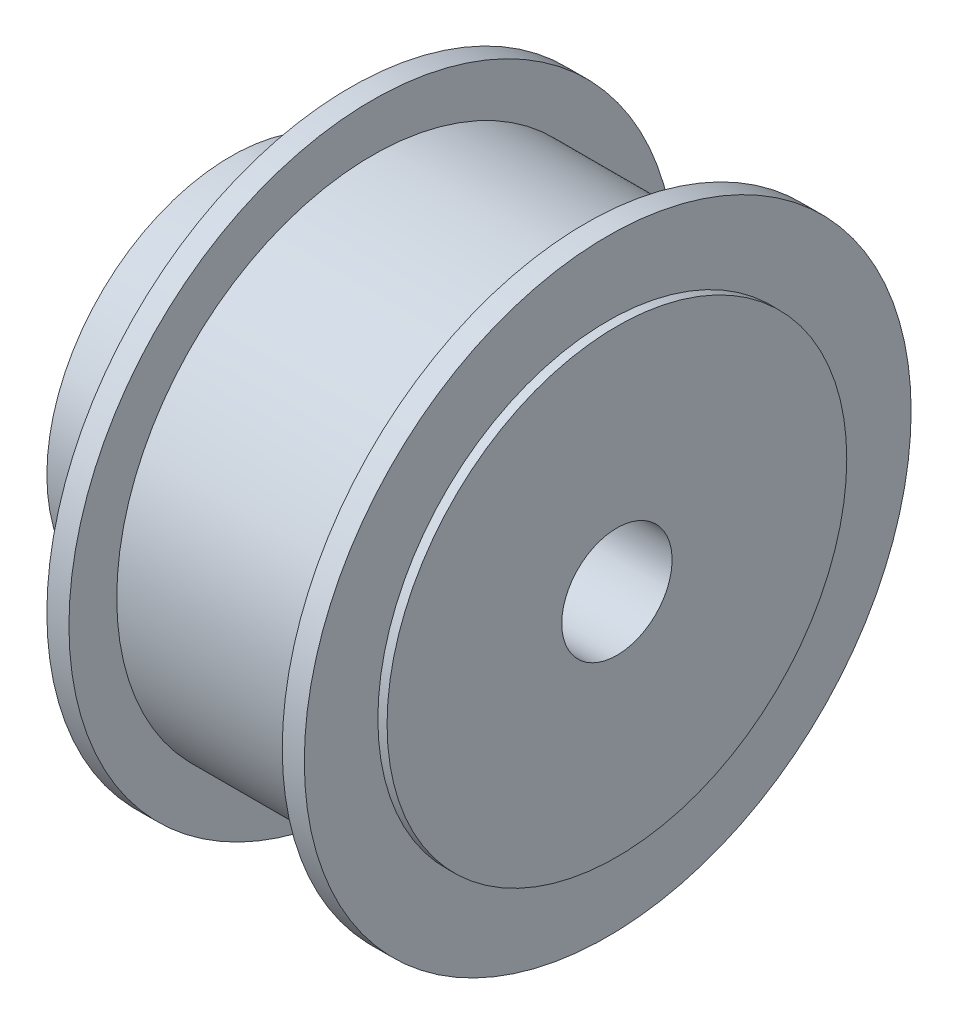
ISO-10303-21;
HEADER;
FILE_DESCRIPTION(('STEP AP214'),'2;1');
FILE_NAME('part.step','',(''),(''),'','','');
FILE_SCHEMA(('AUTOMOTIVE_DESIGN { 1 0 10303 214 1 1 1 1 }'));
ENDSEC;
DATA;
#1=APPLICATION_CONTEXT('core data for automotive mechanical design processes');
#2=APPLICATION_PROTOCOL_DEFINITION('international standard','automotive_design',2000,#1);
#3=PRODUCT_CONTEXT('',#1,'mechanical');
#4=PRODUCT('Part','Part','',(#3));
#5=PRODUCT_RELATED_PRODUCT_CATEGORY('part','',(#4));
#6=PRODUCT_DEFINITION_FORMATION('','',#4);
#7=PRODUCT_DEFINITION_CONTEXT('part definition',#1,'design');
#8=PRODUCT_DEFINITION('design','',#6,#7);
#9=PRODUCT_DEFINITION_SHAPE('','',#8);
#10=(LENGTH_UNIT() NAMED_UNIT(*) SI_UNIT(.MILLI.,.METRE.));
#11=(NAMED_UNIT(*) PLANE_ANGLE_UNIT() SI_UNIT($,.RADIAN.));
#12=(NAMED_UNIT(*) SI_UNIT($,.STERADIAN.) SOLID_ANGLE_UNIT());
#13=UNCERTAINTY_MEASURE_WITH_UNIT(LENGTH_MEASURE(1.E-05),#10,'distance_accuracy_value','');
#14=(GEOMETRIC_REPRESENTATION_CONTEXT(3) GLOBAL_UNCERTAINTY_ASSIGNED_CONTEXT((#13)) GLOBAL_UNIT_ASSIGNED_CONTEXT((#10,
#11,#12)) REPRESENTATION_CONTEXT('',''));
#15=CARTESIAN_POINT('',(0.,0.,0.));
#16=DIRECTION('',(0.,0.,1.));
#17=DIRECTION('',(1.,0.,0.));
#18=AXIS2_PLACEMENT_3D('',#15,#16,#17);
#19=CARTESIAN_POINT('',(6.,0.,0.));
#20=DIRECTION('',(-1.,0.,0.));
#21=DIRECTION('',(0.,0.,1.));
#22=AXIS2_PLACEMENT_3D('',#19,#20,#21);
#23=CYLINDRICAL_SURFACE('',#22,10.);
#24=CARTESIAN_POINT('',(1.35,0.,-10.));
#25=CARTESIAN_POINT('',(1.35000370098531,-0.0920114531057514,-9.99999843258099));
#26=CARTESIAN_POINT('',(1.35772245868542,-0.184073454347173,-9.99871684765511));
#27=CARTESIAN_POINT('',(1.38838123513793,-0.36561632253533,-9.99372775496381));
#28=CARTESIAN_POINT('',(1.4113353369588,-0.455094721351769,-9.99001800272159));
#29=CARTESIAN_POINT('',(1.47175363893592,-0.628817487751615,-9.98058875631552));
#30=CARTESIAN_POINT('',(1.5092060635603,-0.713066038744485,-9.974870893487));
#31=CARTESIAN_POINT('',(1.59752725414862,-0.874072236504042,-9.96205444853338));
#32=CARTESIAN_POINT('',(1.64839445150501,-0.950830757653329,-9.95495602786423));
#33=CARTESIAN_POINT('',(1.76260877713292,-1.09540879372213,-9.9400912001718));
#34=CARTESIAN_POINT('',(1.82605706361825,-1.16314787882339,-9.93231968689365));
#35=CARTESIAN_POINT('',(1.96341477359323,-1.28706950777735,-9.9170237472334));
#36=CARTESIAN_POINT('',(2.03732485064318,-1.34325132909589,-9.90949933632427));
#37=CARTESIAN_POINT('',(2.19405934367668,-1.44278500045253,-9.89550007731641));
#38=CARTESIAN_POINT('',(2.27693479434388,-1.48605749570899,-9.88903182722124));
#39=CARTESIAN_POINT('',(2.44890262523649,-1.55803674048924,-9.87794796970923));
#40=CARTESIAN_POINT('',(2.53799459364928,-1.58674445381556,-9.87333223970889));
#41=CARTESIAN_POINT('',(2.71901458200099,-1.6285261950301,-9.86652679242373));
#42=CARTESIAN_POINT('',(2.81090975567876,-1.64173895927951,-9.86431555933323));
#43=CARTESIAN_POINT('',(2.99563736592343,-1.65258585530687,-9.86250435770823));
#44=CARTESIAN_POINT('',(3.08846973703063,-1.65022106770359,-9.86290420804218));
#45=CARTESIAN_POINT('',(3.27144727705671,-1.63009303176278,-9.86625034802632));
#46=CARTESIAN_POINT('',(3.36161011402737,-1.61248549472488,-9.86917088684506));
#47=CARTESIAN_POINT('',(3.5376840705334,-1.5626160736781,-9.87718903199043));
#48=CARTESIAN_POINT('',(3.62359504678828,-1.53035369619838,-9.88228671162733));
#49=CARTESIAN_POINT('',(3.78919352992442,-1.45193210975571,-9.89411264039674));
#50=CARTESIAN_POINT('',(3.86884978924069,-1.4057081060585,-9.90084846298694));
#51=CARTESIAN_POINT('',(4.01933432390775,-1.30072141548377,-9.9151864393107));
#52=CARTESIAN_POINT('',(4.09016189991229,-1.24195773629987,-9.92278866158316));
#53=CARTESIAN_POINT('',(4.22187997888267,-1.11271072676603,-9.93811607123993));
#54=CARTESIAN_POINT('',(4.28263939462996,-1.04209376928223,-9.94584163094155));
#55=CARTESIAN_POINT('',(4.39146602160627,-0.891597059898565,-9.96045987838133));
#56=CARTESIAN_POINT('',(4.43953315404709,-0.811717250503357,-9.9673525609492));
#57=CARTESIAN_POINT('',(4.52162215053432,-0.644840083170753,-9.97953794169528));
#58=CARTESIAN_POINT('',(4.55563258763802,-0.557837003156559,-9.98482933722619));
#59=CARTESIAN_POINT('',(4.60852191277534,-0.37924693000247,-9.99320544362233));
#60=CARTESIAN_POINT('',(4.62740204114479,-0.287660313260821,-9.99629033536768));
#61=CARTESIAN_POINT('',(4.64931746116117,-0.103632983819161,-9.99988156603306));
#62=CARTESIAN_POINT('',(4.65253273612153,-0.0112142564118357,-10.0004171933872));
#63=CARTESIAN_POINT('',(4.64350680131974,0.172841505554681,-9.99892971175882));
#64=CARTESIAN_POINT('',(4.63126617403953,0.264478569441164,-9.99690669920295));
#65=CARTESIAN_POINT('',(4.5918255972229,0.44381495554177,-9.99054737820398));
#66=CARTESIAN_POINT('',(4.56471460569165,0.531534371938302,-9.98622483070291));
#67=CARTESIAN_POINT('',(4.49639760744493,0.701182959294593,-9.97574921956607));
#68=CARTESIAN_POINT('',(4.45519082233832,0.78311181018899,-9.96959605484327));
#69=CARTESIAN_POINT('',(4.35943868050101,0.939636398877252,-9.95606928426946));
#70=CARTESIAN_POINT('',(4.3047807140829,1.01416235726447,-9.94868555427359));
#71=CARTESIAN_POINT('',(4.18383285093121,1.15304841333209,-9.93354765732487));
#72=CARTESIAN_POINT('',(4.11754212714571,1.21740778758216,-9.92579346406183));
#73=CARTESIAN_POINT('',(3.9744038936717,1.33479962911472,-9.91069407401676));
#74=CARTESIAN_POINT('',(3.89745612890119,1.38771058951943,-9.90335382329475));
#75=CARTESIAN_POINT('',(3.73565895293253,1.47985547415617,-9.89000528724129));
#76=CARTESIAN_POINT('',(3.65080978866809,1.51908982562647,-9.88399696030451));
#77=CARTESIAN_POINT('',(3.47596046759685,1.58258535747086,-9.87402953570153));
#78=CARTESIAN_POINT('',(3.38598290020333,1.60690737863649,-9.87006212213643));
#79=CARTESIAN_POINT('',(3.20314868821944,1.64007952798876,-9.86460473721113));
#80=CARTESIAN_POINT('',(3.11029228915184,1.64893097191818,-9.86311455516768));
#81=CARTESIAN_POINT('',(2.92554935869819,1.65087457438795,-9.86278931217107));
#82=CARTESIAN_POINT('',(2.83366483980789,1.64415796786954,-9.86392203182987));
#83=CARTESIAN_POINT('',(2.65235224813613,1.61556925478547,-9.86864441177183));
#84=CARTESIAN_POINT('',(2.5629241678464,1.59369719454886,-9.87223406454433));
#85=CARTESIAN_POINT('',(2.38913475756459,1.53549112071356,-9.88145370519205));
#86=CARTESIAN_POINT('',(2.30476789254903,1.49917324977366,-9.88708141498759));
#87=CARTESIAN_POINT('',(2.14329373313968,1.41312606218935,-9.8997453323177));
#88=CARTESIAN_POINT('',(2.06618678727227,1.36339610211421,-9.90678160742252));
#89=CARTESIAN_POINT('',(1.92045450236231,1.25125259966706,-9.92157214136343));
#90=CARTESIAN_POINT('',(1.85193824018043,1.18869826623127,-9.92933379899765));
#91=CARTESIAN_POINT('',(1.72630940012324,1.05297867490409,-9.94464125601211));
#92=CARTESIAN_POINT('',(1.66919945921976,0.979810970092671,-9.95218700513286));
#93=CARTESIAN_POINT('',(1.56765257742652,0.824354696103047,-9.96627143049842));
#94=CARTESIAN_POINT('',(1.52330385202197,0.742007852048188,-9.97280295936929));
#95=CARTESIAN_POINT('',(1.44913664719369,0.570959586923796,-9.98405342047581));
#96=CARTESIAN_POINT('',(1.41930363587476,0.482264623543764,-9.98877416450827));
#97=CARTESIAN_POINT('',(1.38152065847316,0.327682758240929,-9.99483601455804));
#98=CARTESIAN_POINT('',(1.3697192511855,0.2627330667111,-9.99676220083327));
#99=CARTESIAN_POINT('',(1.35395766106689,0.131864227625941,-9.99934474465587));
#100=CARTESIAN_POINT('',(1.34999734748421,0.065945096254669,-10.0000011233775));
#101=CARTESIAN_POINT('',(1.35,0.,-10.));
#102=B_SPLINE_CURVE_WITH_KNOTS('',3,(#24,#25,#26,#27,#28,#29,#30,#31,#32,#33,#34,#35,#36,#37,
#38,#39,#40,#41,#42,#43,#44,#45,#46,#47,#48,#49,#50,#51,#52,#53,#54,#55,#56,#57,#58,#59,#60,#61,
#62,#63,#64,#65,#66,#67,#68,#69,#70,#71,#72,#73,#74,#75,#76,#77,#78,#79,#80,#81,#82,#83,#84,#85,
#86,#87,#88,#89,#90,#91,#92,#93,#94,#95,#96,#97,#98,#99,#100,#101),.UNSPECIFIED.,.T.,.F.,(4,2,2,
2,2,2,2,2,2,2,2,2,2,2,2,2,2,2,2,2,2,2,2,2,2,2,2,2,2,2,2,2,2,2,2,2,2,2,4),(0.,0.275793319008919,
0.551841928312973,0.827666799870599,1.10345943314171,1.38156673144316,1.65969141110741,
1.93949209608634,2.21927426326045,2.49653175525207,2.7737700140227,3.04820914252877,
3.32265751287872,3.59839967320043,3.87416366201708,4.15327572401922,4.43238951858748,
4.71172976565333,4.99104711092802,5.26714751096618,5.54323750600191,5.81769359979006,
6.09216485190805,6.36901711215387,6.64588906369259,6.92556925596461,7.20524071063229,
7.48376340648035,7.76226241335698,8.03735855216247,8.31245385002404,8.58724259883661,
8.86204453269318,9.1400425875962,9.41810483731134,9.6980454687132,9.97770526783284,
10.1753710978727,10.3730336317699),.UNSPECIFIED.);
#103=CARTESIAN_POINT('',(1.35,0.,-10.));
#104=VERTEX_POINT('',#103);
#105=EDGE_CURVE('E10',#104,#104,#102,.T.);
#106=ORIENTED_EDGE('',*,*,#105,.T.);
#107=EDGE_LOOP('',(#106));
#108=FACE_BOUND('',#107,.T.);
#109=CARTESIAN_POINT('',(6.,0.,0.));
#110=DIRECTION('',(1.,0.,0.));
#111=DIRECTION('',(0.,0.,-1.));
#112=AXIS2_PLACEMENT_3D('',#109,#110,#111);
#113=CIRCLE('',#112,10.);
#114=CARTESIAN_POINT('',(6.,0.,-10.));
#115=VERTEX_POINT('',#114);
#116=EDGE_CURVE('E72',#115,#115,#113,.T.);
#117=ORIENTED_EDGE('',*,*,#116,.F.);
#118=EDGE_LOOP('',(#117));
#119=FACE_BOUND('',#118,.T.);
#120=CARTESIAN_POINT('',(0.,0.,0.));
#121=DIRECTION('',(1.,0.,0.));
#122=DIRECTION('',(0.,0.,-1.));
#123=AXIS2_PLACEMENT_3D('',#120,#121,#122);
#124=CIRCLE('',#123,10.);
#125=CARTESIAN_POINT('',(0.,0.,-10.));
#126=VERTEX_POINT('',#125);
#127=EDGE_CURVE('E101',#126,#126,#124,.T.);
#128=ORIENTED_EDGE('',*,*,#127,.T.);
#129=EDGE_LOOP('',(#128));
#130=FACE_BOUND('',#129,.T.);
#131=ADVANCED_FACE('F47',(#108,#119,#130),#23,.T.);
#132=CARTESIAN_POINT('',(0.,0.,0.));
#133=DIRECTION('',(1.,0.,0.));
#134=DIRECTION('',(0.,0.,-1.));
#135=AXIS2_PLACEMENT_3D('',#132,#133,#134);
#136=PLANE('',#135);
#137=CARTESIAN_POINT('',(0.,0.,0.));
#138=DIRECTION('',(-1.,0.,0.));
#139=DIRECTION('',(0.,0.,1.));
#140=AXIS2_PLACEMENT_3D('',#137,#138,#139);
#141=CIRCLE('',#140,3.);
#142=CARTESIAN_POINT('',(0.,0.,3.));
#143=VERTEX_POINT('',#142);
#144=EDGE_CURVE('E179',#143,#143,#141,.T.);
#145=ORIENTED_EDGE('',*,*,#144,.F.);
#146=EDGE_LOOP('',(#145));
#147=FACE_BOUND('',#146,.T.);
#148=ORIENTED_EDGE('',*,*,#127,.F.);
#149=EDGE_LOOP('',(#148));
#150=FACE_BOUND('',#149,.T.);
#151=ADVANCED_FACE('F112',(#147,#150),#136,.F.);
#152=CARTESIAN_POINT('',(6.5,0.,0.));
#153=DIRECTION('',(-1.,0.,0.));
#154=DIRECTION('',(0.,0.,1.));
#155=AXIS2_PLACEMENT_3D('',#152,#153,#154);
#156=CYLINDRICAL_SURFACE('',#155,12.5);
#157=CARTESIAN_POINT('',(6.5,0.,0.));
#158=DIRECTION('',(1.,0.,0.));
#159=DIRECTION('',(0.,0.,-1.));
#160=AXIS2_PLACEMENT_3D('',#157,#158,#159);
#161=CIRCLE('',#160,12.5);
#162=CARTESIAN_POINT('',(6.5,0.,-12.5));
#163=VERTEX_POINT('',#162);
#164=EDGE_CURVE('E100',#163,#163,#161,.T.);
#165=ORIENTED_EDGE('',*,*,#164,.F.);
#166=EDGE_LOOP('',(#165));
#167=FACE_BOUND('',#166,.T.);
#168=CARTESIAN_POINT('',(6.,0.,0.));
#169=DIRECTION('',(1.,0.,0.));
#170=DIRECTION('',(0.,0.,-1.));
#171=AXIS2_PLACEMENT_3D('',#168,#169,#170);
#172=CIRCLE('',#171,12.5);
#173=CARTESIAN_POINT('',(6.,0.,-12.5));
#174=VERTEX_POINT('',#173);
#175=EDGE_CURVE('E95',#174,#174,#172,.T.);
#176=ORIENTED_EDGE('',*,*,#175,.T.);
#177=EDGE_LOOP('',(#176));
#178=FACE_BOUND('',#177,.T.);
#179=ADVANCED_FACE('F116',(#167,#178),#156,.T.);
#180=CARTESIAN_POINT('',(6.,0.,0.));
#181=DIRECTION('',(1.,0.,0.));
#182=DIRECTION('',(0.,0.,-1.));
#183=AXIS2_PLACEMENT_3D('',#180,#181,#182);
#184=PLANE('',#183);
#185=ORIENTED_EDGE('',*,*,#116,.T.);
#186=EDGE_LOOP('',(#185));
#187=FACE_BOUND('',#186,.T.);
#188=ORIENTED_EDGE('',*,*,#175,.F.);
#189=EDGE_LOOP('',(#188));
#190=FACE_BOUND('',#189,.T.);
#191=ADVANCED_FACE('F124',(#187,#190),#184,.F.);
#192=CARTESIAN_POINT('',(7.7,0.,0.));
#193=DIRECTION('',(-1.,0.,0.));
#194=DIRECTION('',(0.,0.,1.));
#195=AXIS2_PLACEMENT_3D('',#192,#193,#194);
#196=CYLINDRICAL_SURFACE('',#195,16.5);
#197=CARTESIAN_POINT('',(7.7,0.,0.));
#198=DIRECTION('',(1.,0.,0.));
#199=DIRECTION('',(0.,0.,-1.));
#200=AXIS2_PLACEMENT_3D('',#197,#198,#199);
#201=CIRCLE('',#200,16.5);
#202=CARTESIAN_POINT('',(7.7,0.,-16.5));
#203=VERTEX_POINT('',#202);
#204=EDGE_CURVE('E91',#203,#203,#201,.T.);
#205=ORIENTED_EDGE('',*,*,#204,.F.);
#206=EDGE_LOOP('',(#205));
#207=FACE_BOUND('',#206,.T.);
#208=CARTESIAN_POINT('',(6.5,0.,0.));
#209=DIRECTION('',(1.,0.,0.));
#210=DIRECTION('',(0.,0.,-1.));
#211=AXIS2_PLACEMENT_3D('',#208,#209,#210);
#212=CIRCLE('',#211,16.5);
#213=CARTESIAN_POINT('',(6.5,0.,-16.5));
#214=VERTEX_POINT('',#213);
#215=EDGE_CURVE('E89',#214,#214,#212,.T.);
#216=ORIENTED_EDGE('',*,*,#215,.T.);
#217=EDGE_LOOP('',(#216));
#218=FACE_BOUND('',#217,.T.);
#219=ADVANCED_FACE('F132',(#207,#218),#196,.T.);
#220=CARTESIAN_POINT('',(7.7,0.,0.));
#221=DIRECTION('',(1.,0.,0.));
#222=DIRECTION('',(0.,0.,-1.));
#223=AXIS2_PLACEMENT_3D('',#220,#221,#222);
#224=PLANE('',#223);
#225=CARTESIAN_POINT('',(7.7,0.,0.));
#226=DIRECTION('',(1.,0.,0.));
#227=DIRECTION('',(0.,0.,-1.));
#228=AXIS2_PLACEMENT_3D('',#225,#226,#227);
#229=CIRCLE('',#228,13.9);
#230=CARTESIAN_POINT('',(7.7,0.,-13.9));
#231=VERTEX_POINT('',#230);
#232=EDGE_CURVE('E67',#231,#231,#229,.T.);
#233=ORIENTED_EDGE('',*,*,#232,.F.);
#234=EDGE_LOOP('',(#233));
#235=FACE_BOUND('',#234,.T.);
#236=ORIENTED_EDGE('',*,*,#204,.T.);
#237=EDGE_LOOP('',(#236));
#238=FACE_BOUND('',#237,.T.);
#239=ADVANCED_FACE('F131',(#235,#238),#224,.T.);
#240=CARTESIAN_POINT('',(6.5,0.,0.));
#241=DIRECTION('',(1.,0.,0.));
#242=DIRECTION('',(0.,0.,-1.));
#243=AXIS2_PLACEMENT_3D('',#240,#241,#242);
#244=PLANE('',#243);
#245=ORIENTED_EDGE('',*,*,#164,.T.);
#246=EDGE_LOOP('',(#245));
#247=FACE_BOUND('',#246,.T.);
#248=ORIENTED_EDGE('',*,*,#215,.F.);
#249=EDGE_LOOP('',(#248));
#250=FACE_BOUND('',#249,.T.);
#251=ADVANCED_FACE('F137',(#247,#250),#244,.F.);
#252=CARTESIAN_POINT('',(19.3,0.,0.));
#253=DIRECTION('',(-1.,0.,0.));
#254=DIRECTION('',(0.,0.,1.));
#255=AXIS2_PLACEMENT_3D('',#252,#253,#254);
#256=CYLINDRICAL_SURFACE('',#255,13.9);
#257=CARTESIAN_POINT('',(19.3,0.,0.));
#258=DIRECTION('',(1.,0.,0.));
#259=DIRECTION('',(0.,0.,-1.));
#260=AXIS2_PLACEMENT_3D('',#257,#258,#259);
#261=CIRCLE('',#260,13.9);
#262=CARTESIAN_POINT('',(19.3,0.,-13.9));
#263=VERTEX_POINT('',#262);
#264=EDGE_CURVE('E81',#263,#263,#261,.T.);
#265=ORIENTED_EDGE('',*,*,#264,.F.);
#266=EDGE_LOOP('',(#265));
#267=FACE_BOUND('',#266,.T.);
#268=ORIENTED_EDGE('',*,*,#232,.T.);
#269=EDGE_LOOP('',(#268));
#270=FACE_BOUND('',#269,.T.);
#271=ADVANCED_FACE('F140',(#267,#270),#256,.T.);
#272=CARTESIAN_POINT('',(20.5,0.,0.));
#273=DIRECTION('',(-1.,0.,0.));
#274=DIRECTION('',(0.,0.,1.));
#275=AXIS2_PLACEMENT_3D('',#272,#273,#274);
#276=CYLINDRICAL_SURFACE('',#275,16.5);
#277=CARTESIAN_POINT('',(20.5,0.,0.));
#278=DIRECTION('',(1.,0.,0.));
#279=DIRECTION('',(0.,0.,-1.));
#280=AXIS2_PLACEMENT_3D('',#277,#278,#279);
#281=CIRCLE('',#280,16.5);
#282=CARTESIAN_POINT('',(20.5,0.,-16.5));
#283=VERTEX_POINT('',#282);
#284=EDGE_CURVE('E76',#283,#283,#281,.T.);
#285=ORIENTED_EDGE('',*,*,#284,.F.);
#286=EDGE_LOOP('',(#285));
#287=FACE_BOUND('',#286,.T.);
#288=CARTESIAN_POINT('',(19.3,0.,0.));
#289=DIRECTION('',(1.,0.,0.));
#290=DIRECTION('',(0.,0.,-1.));
#291=AXIS2_PLACEMENT_3D('',#288,#289,#290);
#292=CIRCLE('',#291,16.5);
#293=CARTESIAN_POINT('',(19.3,0.,-16.5));
#294=VERTEX_POINT('',#293);
#295=EDGE_CURVE('E85',#294,#294,#292,.T.);
#296=ORIENTED_EDGE('',*,*,#295,.T.);
#297=EDGE_LOOP('',(#296));
#298=FACE_BOUND('',#297,.T.);
#299=ADVANCED_FACE('F146',(#287,#298),#276,.T.);
#300=CARTESIAN_POINT('',(20.5,0.,0.));
#301=DIRECTION('',(1.,0.,0.));
#302=DIRECTION('',(0.,0.,-1.));
#303=AXIS2_PLACEMENT_3D('',#300,#301,#302);
#304=PLANE('',#303);
#305=CARTESIAN_POINT('',(20.5,0.,0.));
#306=DIRECTION('',(1.,0.,0.));
#307=DIRECTION('',(0.,0.,-1.));
#308=AXIS2_PLACEMENT_3D('',#305,#306,#307);
#309=CIRCLE('',#308,12.5);
#310=CARTESIAN_POINT('',(20.5,0.,-12.5));
#311=VERTEX_POINT('',#310);
#312=EDGE_CURVE('E64',#311,#311,#309,.T.);
#313=ORIENTED_EDGE('',*,*,#312,.F.);
#314=EDGE_LOOP('',(#313));
#315=FACE_BOUND('',#314,.T.);
#316=ORIENTED_EDGE('',*,*,#284,.T.);
#317=EDGE_LOOP('',(#316));
#318=FACE_BOUND('',#317,.T.);
#319=ADVANCED_FACE('F152',(#315,#318),#304,.T.);
#320=CARTESIAN_POINT('',(19.3,0.,0.));
#321=DIRECTION('',(1.,0.,0.));
#322=DIRECTION('',(0.,0.,-1.));
#323=AXIS2_PLACEMENT_3D('',#320,#321,#322);
#324=PLANE('',#323);
#325=ORIENTED_EDGE('',*,*,#264,.T.);
#326=EDGE_LOOP('',(#325));
#327=FACE_BOUND('',#326,.T.);
#328=ORIENTED_EDGE('',*,*,#295,.F.);
#329=EDGE_LOOP('',(#328));
#330=FACE_BOUND('',#329,.T.);
#331=ADVANCED_FACE('F153',(#327,#330),#324,.F.);
#332=CARTESIAN_POINT('',(21.,0.,0.));
#333=DIRECTION('',(-1.,0.,0.));
#334=DIRECTION('',(0.,0.,1.));
#335=AXIS2_PLACEMENT_3D('',#332,#333,#334);
#336=CYLINDRICAL_SURFACE('',#335,12.5);
#337=CARTESIAN_POINT('',(21.,0.,0.));
#338=DIRECTION('',(1.,0.,0.));
#339=DIRECTION('',(0.,0.,-1.));
#340=AXIS2_PLACEMENT_3D('',#337,#338,#339);
#341=CIRCLE('',#340,12.5);
#342=CARTESIAN_POINT('',(21.,0.,-12.5));
#343=VERTEX_POINT('',#342);
#344=EDGE_CURVE('E77',#343,#343,#341,.T.);
#345=ORIENTED_EDGE('',*,*,#344,.F.);
#346=EDGE_LOOP('',(#345));
#347=FACE_BOUND('',#346,.T.);
#348=ORIENTED_EDGE('',*,*,#312,.T.);
#349=EDGE_LOOP('',(#348));
#350=FACE_BOUND('',#349,.T.);
#351=ADVANCED_FACE('F156',(#347,#350),#336,.T.);
#352=CARTESIAN_POINT('',(21.,0.,0.));
#353=DIRECTION('',(1.,0.,0.));
#354=DIRECTION('',(0.,0.,-1.));
#355=AXIS2_PLACEMENT_3D('',#352,#353,#354);
#356=PLANE('',#355);
#357=CARTESIAN_POINT('',(21.,0.,0.));
#358=DIRECTION('',(-1.,0.,0.));
#359=DIRECTION('',(0.,0.,1.));
#360=AXIS2_PLACEMENT_3D('',#357,#358,#359);
#361=CIRCLE('',#360,3.);
#362=CARTESIAN_POINT('',(21.,0.,3.));
#363=VERTEX_POINT('',#362);
#364=EDGE_CURVE('E181',#363,#363,#361,.T.);
#365=ORIENTED_EDGE('',*,*,#364,.T.);
#366=EDGE_LOOP('',(#365));
#367=FACE_BOUND('',#366,.T.);
#368=ORIENTED_EDGE('',*,*,#344,.T.);
#369=EDGE_LOOP('',(#368));
#370=FACE_BOUND('',#369,.T.);
#371=ADVANCED_FACE('F162',(#367,#370),#356,.T.);
#372=CARTESIAN_POINT('',(21.,0.,0.));
#373=DIRECTION('',(-1.,0.,0.));
#374=DIRECTION('',(0.,0.,1.));
#375=AXIS2_PLACEMENT_3D('',#372,#373,#374);
#376=CYLINDRICAL_SURFACE('',#375,3.);
#377=CARTESIAN_POINT('',(1.35,0.,-3.));
#378=CARTESIAN_POINT('',(1.35000538337831,0.0856699475452994,-2.99999513886583));
#379=CARTESIAN_POINT('',(1.35671064559098,0.171409071205646,-2.99629302255545));
#380=CARTESIAN_POINT('',(1.38320221523037,0.340286051726047,-2.9818478399119));
#381=CARTESIAN_POINT('',(1.40300637834803,0.42342019537986,-2.97109516282085));
#382=CARTESIAN_POINT('',(1.45465446432168,0.584401577928637,-2.9436571869529));
#383=CARTESIAN_POINT('',(1.48644877862966,0.662269062667418,-2.92699634956489));
#384=CARTESIAN_POINT('',(1.56087866817395,0.811408240635762,-2.8892116252981));
#385=CARTESIAN_POINT('',(1.60351470658008,0.882679651896673,-2.86808754775153));
#386=CARTESIAN_POINT('',(1.70171533312459,1.02211619357275,-2.82153252993505));
#387=CARTESIAN_POINT('',(1.75796752444415,1.08973037342791,-2.79590528013302));
#388=CARTESIAN_POINT('',(1.8802916084601,1.21508634233517,-2.74375354722835));
#389=CARTESIAN_POINT('',(1.94637257436953,1.2728189023456,-2.71722825277821));
#390=CARTESIAN_POINT('',(2.09422598592267,1.38251917690996,-2.66321895829991));
#391=CARTESIAN_POINT('',(2.17690296148472,1.43335857713386,-2.635897965792));
#392=CARTESIAN_POINT('',(2.35122736563263,1.52021547735939,-2.58678336476683));
#393=CARTESIAN_POINT('',(2.44286763485725,1.5562446891168,-2.56498539395023));
#394=CARTESIAN_POINT('',(2.6267694484273,1.60989890926138,-2.53163475086558));
#395=CARTESIAN_POINT('',(2.71862615345284,1.62854263347079,-2.51952192354843));
#396=CARTESIAN_POINT('',(2.90488944855667,1.64991120631134,-2.5055890563389));
#397=CARTESIAN_POINT('',(2.99929218702398,1.65265887915297,-2.50375425894472));
#398=CARTESIAN_POINT('',(3.17242835674957,1.64290000078864,-2.51015646726158));
#399=CARTESIAN_POINT('',(3.25135975849933,1.63265157443424,-2.51690299364892));
#400=CARTESIAN_POINT('',(3.40612941990325,1.60118639026894,-2.53703527550373));
#401=CARTESIAN_POINT('',(3.4819662536941,1.5799646365691,-2.55042405491467));
#402=CARTESIAN_POINT('',(3.6304823200009,1.52687641342515,-2.58256130946142));
#403=CARTESIAN_POINT('',(3.7030582377923,1.49479033069661,-2.60141910516922));
#404=CARTESIAN_POINT('',(3.84217102059683,1.42107429999088,-2.64240902469132));
#405=CARTESIAN_POINT('',(3.90870526158193,1.37944023253661,-2.66454256035721));
#406=CARTESIAN_POINT('',(4.04489478358012,1.28018349411555,-2.71379040847906));
#407=CARTESIAN_POINT('',(4.11338605188438,1.22107458392543,-2.74113957142577));
#408=CARTESIAN_POINT('',(4.24002658065135,1.09224532196501,-2.79497377887706));
#409=CARTESIAN_POINT('',(4.29816876589242,1.02251777065964,-2.82145822218593));
#410=CARTESIAN_POINT('',(4.40621482668338,0.868605041800935,-2.87272134052732));
#411=CARTESIAN_POINT('',(4.45530464062892,0.783763861453042,-2.89726648156192));
#412=CARTESIAN_POINT('',(4.53808075343747,0.605352377645232,-2.93971528365153));
#413=CARTESIAN_POINT('',(4.57178153416669,0.511790381195993,-2.95762518579738));
#414=CARTESIAN_POINT('',(4.61961221043824,0.327907037980977,-2.98333345624201));
#415=CARTESIAN_POINT('',(4.63527255151752,0.238095480523288,-2.99191822782612));
#416=CARTESIAN_POINT('',(4.65153082870693,0.0567325334425129,-3.00083376662002));
#417=CARTESIAN_POINT('',(4.65213838996179,-0.0348177069344352,-3.00116980828416));
#418=CARTESIAN_POINT('',(4.63896548669445,-0.207487375150858,-2.99394177831786));
#419=CARTESIAN_POINT('',(4.62658539871821,-0.288751776237441,-2.98714659587173));
#420=CARTESIAN_POINT('',(4.59015740266736,-0.447838849624849,-2.96746793830126));
#421=CARTESIAN_POINT('',(4.56610831443354,-0.525661172937912,-2.95458384737082));
#422=CARTESIAN_POINT('',(4.50664238404831,-0.677753407865904,-2.92349378037743));
#423=CARTESIAN_POINT('',(4.47098230445308,-0.751904240945377,-2.90517475144826));
#424=CARTESIAN_POINT('',(4.38962865370027,-0.893363199749704,-2.86484215103297));
#425=CARTESIAN_POINT('',(4.34393141551639,-0.960668811424107,-2.8428272299655));
#426=CARTESIAN_POINT('',(4.23795528586164,-1.09455456288909,-2.79420331593949));
#427=CARTESIAN_POINT('',(4.176616716341,-1.16021004375818,-2.76735592347542));
#428=CARTESIAN_POINT('',(4.04407557032251,-1.28079913012788,-2.71365440736755));
#429=CARTESIAN_POINT('',(3.97286284071763,-1.33572155748716,-2.6868003055646));
#430=CARTESIAN_POINT('',(3.81583580659286,-1.43747254066661,-2.63385875511374));
#431=CARTESIAN_POINT('',(3.72931692312463,-1.48334076829298,-2.60799295737883));
#432=CARTESIAN_POINT('',(3.54800592029134,-1.55942876653783,-2.56323063992907));
#433=CARTESIAN_POINT('',(3.45322608860007,-1.58967133039468,-2.54432398053561));
#434=CARTESIAN_POINT('',(3.26773762241447,-1.6306246255404,-2.51825420457376));
#435=CARTESIAN_POINT('',(3.1775252194605,-1.64294477567078,-2.51013022153209));
#436=CARTESIAN_POINT('',(2.99598953071196,-1.65249034912289,-2.50386093509844));
#437=CARTESIAN_POINT('',(2.90466726572743,-1.64972872967261,-2.50570706604924));
#438=CARTESIAN_POINT('',(2.73678047844449,-1.63075691736924,-2.51807870697286));
#439=CARTESIAN_POINT('',(2.65989902646687,-1.61642825416934,-2.52738874118224));
#440=CARTESIAN_POINT('',(2.50980458104002,-1.57741079979876,-2.55192145753237));
#441=CARTESIAN_POINT('',(2.43659310839999,-1.55271775279779,-2.56714656833463));
#442=CARTESIAN_POINT('',(2.29086035370703,-1.492056117962,-2.60289749299614));
#443=CARTESIAN_POINT('',(2.2186560041008,-1.45548954002738,-2.62369085726804));
#444=CARTESIAN_POINT('',(2.08092397849966,-1.37268509596928,-2.66794671801683));
#445=CARTESIAN_POINT('',(2.01539987321332,-1.32644209751913,-2.69141062791391));
#446=CARTESIAN_POINT('',(1.88215026044466,-1.21715006880685,-2.74276036037727));
#447=CARTESIAN_POINT('',(1.81569176481672,-1.15260264369496,-2.77076245736401));
#448=CARTESIAN_POINT('',(1.69411557257786,-1.01279351012943,-2.82486614857147));
#449=CARTESIAN_POINT('',(1.639006018451,-0.937524174112383,-2.85096636964491));
#450=CARTESIAN_POINT('',(1.54006196603414,-0.774887264813823,-2.89948189270181));
#451=CARTESIAN_POINT('',(1.49668643559364,-0.687189892415587,-2.92173740350452));
#452=CARTESIAN_POINT('',(1.42589028566925,-0.504223640414891,-2.95878417900051));
#453=CARTESIAN_POINT('',(1.39842875222927,-0.408974898948848,-2.97359457153256));
#454=CARTESIAN_POINT('',(1.36985794198771,-0.26051061851907,-2.98911434756595));
#455=CARTESIAN_POINT('',(1.36242756798774,-0.20878305643392,-2.99318008334623));
#456=CARTESIAN_POINT('',(1.35249698717911,-0.104712273399591,-2.99862437594614));
#457=CARTESIAN_POINT('',(1.34999670920227,-0.0523690613485737,-3.00000297155585));
#458=CARTESIAN_POINT('',(1.35,0.,-3.));
#459=B_SPLINE_CURVE_WITH_KNOTS('',3,(#377,#378,#379,#380,#381,#382,#383,#384,#385,#386,#387,
#388,#389,#390,#391,#392,#393,#394,#395,#396,#397,#398,#399,#400,#401,#402,#403,#404,#405,#406,
#407,#408,#409,#410,#411,#412,#413,#414,#415,#416,#417,#418,#419,#420,#421,#422,#423,#424,#425,
#426,#427,#428,#429,#430,#431,#432,#433,#434,#435,#436,#437,#438,#439,#440,#441,#442,#443,#444,
#445,#446,#447,#448,#449,#450,#451,#452,#453,#454,#455,#456,#457,#458),.UNSPECIFIED.,.T.,.F.,(4,
2,2,2,2,2,2,2,2,2,2,2,2,2,2,2,2,2,2,2,2,2,2,2,2,2,2,2,2,2,2,2,2,2,2,2,2,2,2,2,4),(0.,
0.256799016537927,0.513948810602823,0.770046131883808,1.02615439574975,1.29988051794781,
1.57386091081864,1.87483382859252,2.17556827984511,2.45730761481344,2.7386423161532,
2.97715628850378,3.21577894619804,3.45954576386221,3.70341795322453,3.98576982265921,
4.26831398861796,4.5698079028087,4.87101750814851,5.14417314031286,5.41715410504554,
5.66345591892143,5.90978264803878,6.16164305576709,6.41359563296034,6.69375293580821,
6.97420047673715,7.27643629132653,7.57822997932257,7.85076329691247,8.12306250931443,
8.35830132419628,8.59363682764365,8.84338665158086,9.09326927891541,9.38234984684168,
9.6716371032665,9.97098879991468,10.2695674268337,10.4265480013941,10.5835263098519),.UNSPECIFIED.);
#460=CARTESIAN_POINT('',(1.35,0.,-3.));
#461=VERTEX_POINT('',#460);
#462=EDGE_CURVE('E173',#461,#461,#459,.T.);
#463=ORIENTED_EDGE('',*,*,#462,.T.);
#464=EDGE_LOOP('',(#463));
#465=FACE_BOUND('',#464,.T.);
#466=ORIENTED_EDGE('',*,*,#364,.F.);
#467=EDGE_LOOP('',(#466));
#468=FACE_BOUND('',#467,.T.);
#469=ORIENTED_EDGE('',*,*,#144,.T.);
#470=EDGE_LOOP('',(#469));
#471=FACE_BOUND('',#470,.T.);
#472=ADVANCED_FACE('F164',(#465,#468,#471),#376,.F.);
#473=CARTESIAN_POINT('',(3.,0.,-10.));
#474=DIRECTION('',(0.,0.,-1.));
#475=DIRECTION('',(-1.,0.,0.));
#476=AXIS2_PLACEMENT_3D('',#473,#474,#475);
#477=CYLINDRICAL_SURFACE('',#476,1.65);
#478=ORIENTED_EDGE('',*,*,#105,.F.);
#479=EDGE_LOOP('',(#478));
#480=FACE_BOUND('',#479,.T.);
#481=ORIENTED_EDGE('',*,*,#462,.F.);
#482=EDGE_LOOP('',(#481));
#483=FACE_BOUND('',#482,.T.);
#484=ADVANCED_FACE('F169',(#480,#483),#477,.F.);
#485=CLOSED_SHELL('',(#131,#151,#179,#191,#219,#239,#251,#271,#299,#319,#331,#351,#371,#472,#484));
#486=MANIFOLD_SOLID_BREP('B2',#485);
#487=ADVANCED_BREP_SHAPE_REPRESENTATION('',(#18,#486),#14);
#488=SHAPE_DEFINITION_REPRESENTATION(#9,#487);
ENDSEC;
END-ISO-10303-21;
